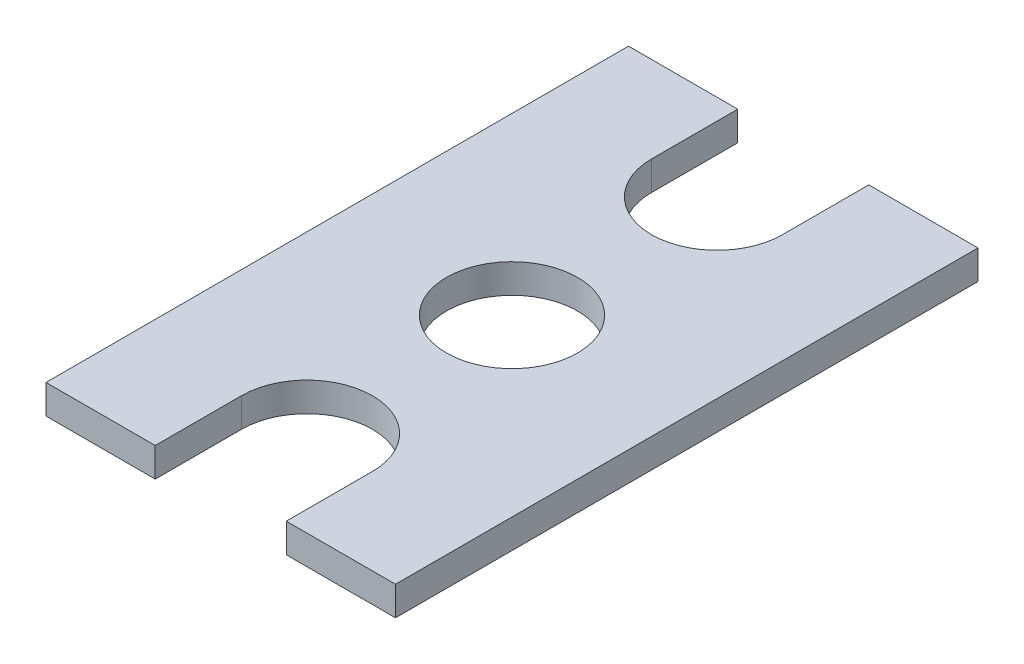
ISO-10303-21;
HEADER;
FILE_DESCRIPTION(('STEP AP214'),'2;1');
FILE_NAME('part.step','',(''),(''),'','','');
FILE_SCHEMA(('AUTOMOTIVE_DESIGN { 1 0 10303 214 1 1 1 1 }'));
ENDSEC;
DATA;
#1=APPLICATION_CONTEXT('core data for automotive mechanical design processes');
#2=APPLICATION_PROTOCOL_DEFINITION('international standard','automotive_design',2000,#1);
#3=PRODUCT_CONTEXT('',#1,'mechanical');
#4=PRODUCT('Part','Part','',(#3));
#5=PRODUCT_RELATED_PRODUCT_CATEGORY('part','',(#4));
#6=PRODUCT_DEFINITION_FORMATION('','',#4);
#7=PRODUCT_DEFINITION_CONTEXT('part definition',#1,'design');
#8=PRODUCT_DEFINITION('design','',#6,#7);
#9=PRODUCT_DEFINITION_SHAPE('','',#8);
#10=(LENGTH_UNIT() NAMED_UNIT(*) SI_UNIT(.MILLI.,.METRE.));
#11=(NAMED_UNIT(*) PLANE_ANGLE_UNIT() SI_UNIT($,.RADIAN.));
#12=(NAMED_UNIT(*) SI_UNIT($,.STERADIAN.) SOLID_ANGLE_UNIT());
#13=UNCERTAINTY_MEASURE_WITH_UNIT(LENGTH_MEASURE(1.E-05),#10,'distance_accuracy_value','');
#14=(GEOMETRIC_REPRESENTATION_CONTEXT(3) GLOBAL_UNCERTAINTY_ASSIGNED_CONTEXT((#13)) GLOBAL_UNIT_ASSIGNED_CONTEXT((#10,
#11,#12)) REPRESENTATION_CONTEXT('',''));
#15=CARTESIAN_POINT('',(0.,0.,0.));
#16=DIRECTION('',(0.,0.,1.));
#17=DIRECTION('',(1.,0.,0.));
#18=AXIS2_PLACEMENT_3D('',#15,#16,#17);
#19=CARTESIAN_POINT('',(-6.35,1.5875,10.287));
#20=DIRECTION('',(0.,1.,0.));
#21=DIRECTION('',(0.,0.,1.));
#22=AXIS2_PLACEMENT_3D('',#19,#20,#21);
#23=PLANE('',#22);
#24=CARTESIAN_POINT('',(3.175,1.5875,-5.588));
#25=DIRECTION('',(0.,1.,0.));
#26=DIRECTION('',(0.,0.,1.));
#27=AXIS2_PLACEMENT_3D('',#24,#25,#26);
#28=CIRCLE('',#27,3.571875);
#29=CARTESIAN_POINT('',(3.175,1.5875,-2.016125));
#30=VERTEX_POINT('',#29);
#31=EDGE_CURVE('E155',#30,#30,#28,.T.);
#32=ORIENTED_EDGE('',*,*,#31,.F.);
#33=EDGE_LOOP('',(#32));
#34=FACE_BOUND('',#33,.T.);
#35=DIRECTION('',(-1.,0.,0.));
#36=VECTOR('',#35,1.);
#37=CARTESIAN_POINT('',(-6.35,1.5875,-21.463));
#38=LINE('',#37,#36);
#39=CARTESIAN_POINT('',(12.7,1.5875,-21.463));
#40=VERTEX_POINT('',#39);
#41=CARTESIAN_POINT('',(6.74687500000019,1.5875,-21.463));
#42=VERTEX_POINT('',#41);
#43=EDGE_CURVE('E133',#40,#42,#38,.T.);
#44=ORIENTED_EDGE('',*,*,#43,.T.);
#45=DIRECTION('',(0.,0.,-1.));
#46=VECTOR('',#45,1.);
#47=CARTESIAN_POINT('',(6.74687500000016,1.5875,-16.764));
#48=LINE('',#47,#46);
#49=CARTESIAN_POINT('',(6.74687500000016,1.5875,-16.764));
#50=VERTEX_POINT('',#49);
#51=EDGE_CURVE('E117',#50,#42,#48,.T.);
#52=ORIENTED_EDGE('',*,*,#51,.F.);
#53=CARTESIAN_POINT('',(3.175,1.5875,-16.764));
#54=DIRECTION('',(0.,1.,0.));
#55=DIRECTION('',(0.,0.,1.));
#56=AXIS2_PLACEMENT_3D('',#53,#54,#55);
#57=CIRCLE('',#56,3.571875);
#58=CARTESIAN_POINT('',(-0.396874999999997,1.5875,-16.764));
#59=VERTEX_POINT('',#58);
#60=EDGE_CURVE('E212',#59,#50,#57,.T.);
#61=ORIENTED_EDGE('',*,*,#60,.F.);
#62=DIRECTION('',(0.,0.,1.));
#63=VECTOR('',#62,1.);
#64=CARTESIAN_POINT('',(-0.396874999999838,1.5875,-16.764));
#65=LINE('',#64,#63);
#66=CARTESIAN_POINT('',(-0.396874999999805,1.5875,-21.463));
#67=VERTEX_POINT('',#66);
#68=EDGE_CURVE('E53',#67,#59,#65,.T.);
#69=ORIENTED_EDGE('',*,*,#68,.F.);
#70=CARTESIAN_POINT('',(-6.35,1.5875,-21.463));
#71=VERTEX_POINT('',#70);
#72=EDGE_CURVE('E143',#67,#71,#38,.T.);
#73=ORIENTED_EDGE('',*,*,#72,.T.);
#74=DIRECTION('',(0.,0.,1.));
#75=VECTOR('',#74,1.);
#76=CARTESIAN_POINT('',(-6.35,1.5875,-21.463));
#77=LINE('',#76,#75);
#78=CARTESIAN_POINT('',(-6.35,1.5875,10.287));
#79=VERTEX_POINT('',#78);
#80=EDGE_CURVE('E162',#71,#79,#77,.T.);
#81=ORIENTED_EDGE('',*,*,#80,.T.);
#82=DIRECTION('',(1.,0.,0.));
#83=VECTOR('',#82,1.);
#84=CARTESIAN_POINT('',(-6.35,1.5875,10.287));
#85=LINE('',#84,#83);
#86=CARTESIAN_POINT('',(-0.396875000000075,1.5875,10.287));
#87=VERTEX_POINT('',#86);
#88=EDGE_CURVE('E222',#79,#87,#85,.T.);
#89=ORIENTED_EDGE('',*,*,#88,.T.);
#90=DIRECTION('',(0.,0.,1.));
#91=VECTOR('',#90,1.);
#92=CARTESIAN_POINT('',(-0.396875000000075,1.5875,5.588));
#93=LINE('',#92,#91);
#94=CARTESIAN_POINT('',(-0.396875000000075,1.5875,5.588));
#95=VERTEX_POINT('',#94);
#96=EDGE_CURVE('E188',#95,#87,#93,.T.);
#97=ORIENTED_EDGE('',*,*,#96,.F.);
#98=CARTESIAN_POINT('',(3.17499999999993,1.5875,5.588));
#99=DIRECTION('',(0.,1.,0.));
#100=DIRECTION('',(0.,0.,-1.));
#101=AXIS2_PLACEMENT_3D('',#98,#99,#100);
#102=CIRCLE('',#101,3.571875);
#103=CARTESIAN_POINT('',(6.74687499999993,1.5875,5.588));
#104=VERTEX_POINT('',#103);
#105=EDGE_CURVE('E207',#104,#95,#102,.T.);
#106=ORIENTED_EDGE('',*,*,#105,.F.);
#107=DIRECTION('',(0.,0.,-1.));
#108=VECTOR('',#107,1.);
#109=CARTESIAN_POINT('',(6.74687499999992,1.5875,5.588));
#110=LINE('',#109,#108);
#111=CARTESIAN_POINT('',(6.74687499999992,1.5875,10.287));
#112=VERTEX_POINT('',#111);
#113=EDGE_CURVE('E190',#112,#104,#110,.T.);
#114=ORIENTED_EDGE('',*,*,#113,.F.);
#115=CARTESIAN_POINT('',(12.7,1.5875,10.287));
#116=VERTEX_POINT('',#115);
#117=EDGE_CURVE('E221',#112,#116,#85,.T.);
#118=ORIENTED_EDGE('',*,*,#117,.T.);
#119=DIRECTION('',(0.,0.,-1.));
#120=VECTOR('',#119,1.);
#121=CARTESIAN_POINT('',(12.7,1.5875,-21.463));
#122=LINE('',#121,#120);
#123=EDGE_CURVE('E140',#116,#40,#122,.T.);
#124=ORIENTED_EDGE('',*,*,#123,.T.);
#125=EDGE_LOOP('',(#44,#52,#61,#69,#73,#81,#89,#97,#106,#114,#118,#124));
#126=FACE_BOUND('',#125,.T.);
#127=ADVANCED_FACE('F30',(#34,#126),#23,.T.);
#128=CARTESIAN_POINT('',(-6.35,0.,10.287));
#129=DIRECTION('',(0.,1.,0.));
#130=DIRECTION('',(0.,0.,1.));
#131=AXIS2_PLACEMENT_3D('',#128,#129,#130);
#132=PLANE('',#131);
#133=CARTESIAN_POINT('',(3.175,0.,-5.588));
#134=DIRECTION('',(0.,1.,0.));
#135=DIRECTION('',(0.,0.,1.));
#136=AXIS2_PLACEMENT_3D('',#133,#134,#135);
#137=CIRCLE('',#136,3.571875);
#138=CARTESIAN_POINT('',(3.175,0.,-2.016125));
#139=VERTEX_POINT('',#138);
#140=EDGE_CURVE('E214',#139,#139,#137,.T.);
#141=ORIENTED_EDGE('',*,*,#140,.T.);
#142=EDGE_LOOP('',(#141));
#143=FACE_BOUND('',#142,.T.);
#144=DIRECTION('',(0.,0.,-1.));
#145=VECTOR('',#144,1.);
#146=CARTESIAN_POINT('',(6.74687500000016,0.,-16.764));
#147=LINE('',#146,#145);
#148=CARTESIAN_POINT('',(6.746875,0.,-16.764));
#149=VERTEX_POINT('',#148);
#150=CARTESIAN_POINT('',(6.74687500000019,0.,-21.463));
#151=VERTEX_POINT('',#150);
#152=EDGE_CURVE('E45',#149,#151,#147,.T.);
#153=ORIENTED_EDGE('',*,*,#152,.T.);
#154=DIRECTION('',(-1.,0.,0.));
#155=VECTOR('',#154,1.);
#156=CARTESIAN_POINT('',(-6.35,0.,-21.463));
#157=LINE('',#156,#155);
#158=CARTESIAN_POINT('',(12.7,0.,-21.463));
#159=VERTEX_POINT('',#158);
#160=EDGE_CURVE('E135',#159,#151,#157,.T.);
#161=ORIENTED_EDGE('',*,*,#160,.F.);
#162=DIRECTION('',(0.,0.,-1.));
#163=VECTOR('',#162,1.);
#164=CARTESIAN_POINT('',(12.7,0.,-21.463));
#165=LINE('',#164,#163);
#166=CARTESIAN_POINT('',(12.7,0.,10.287));
#167=VERTEX_POINT('',#166);
#168=EDGE_CURVE('E159',#167,#159,#165,.T.);
#169=ORIENTED_EDGE('',*,*,#168,.F.);
#170=DIRECTION('',(1.,0.,0.));
#171=VECTOR('',#170,1.);
#172=CARTESIAN_POINT('',(-6.35,0.,10.287));
#173=LINE('',#172,#171);
#174=CARTESIAN_POINT('',(6.74687499999992,0.,10.287));
#175=VERTEX_POINT('',#174);
#176=EDGE_CURVE('E154',#175,#167,#173,.T.);
#177=ORIENTED_EDGE('',*,*,#176,.F.);
#178=DIRECTION('',(0.,0.,-1.));
#179=VECTOR('',#178,1.);
#180=CARTESIAN_POINT('',(6.74687499999992,0.,5.588));
#181=LINE('',#180,#179);
#182=CARTESIAN_POINT('',(6.74687499999992,0.,5.588));
#183=VERTEX_POINT('',#182);
#184=EDGE_CURVE('E191',#175,#183,#181,.T.);
#185=ORIENTED_EDGE('',*,*,#184,.T.);
#186=CARTESIAN_POINT('',(3.17499999999993,0.,5.588));
#187=DIRECTION('',(0.,1.,0.));
#188=DIRECTION('',(0.,0.,-1.));
#189=AXIS2_PLACEMENT_3D('',#186,#187,#188);
#190=CIRCLE('',#189,3.571875);
#191=CARTESIAN_POINT('',(-0.396875000000075,0.,5.588));
#192=VERTEX_POINT('',#191);
#193=EDGE_CURVE('E206',#183,#192,#190,.T.);
#194=ORIENTED_EDGE('',*,*,#193,.T.);
#195=DIRECTION('',(0.,0.,1.));
#196=VECTOR('',#195,1.);
#197=CARTESIAN_POINT('',(-0.396875000000075,0.,5.588));
#198=LINE('',#197,#196);
#199=CARTESIAN_POINT('',(-0.396875000000075,0.,10.287));
#200=VERTEX_POINT('',#199);
#201=EDGE_CURVE('E136',#192,#200,#198,.T.);
#202=ORIENTED_EDGE('',*,*,#201,.T.);
#203=CARTESIAN_POINT('',(-6.35,0.,10.287));
#204=VERTEX_POINT('',#203);
#205=EDGE_CURVE('E156',#204,#200,#173,.T.);
#206=ORIENTED_EDGE('',*,*,#205,.F.);
#207=DIRECTION('',(0.,0.,1.));
#208=VECTOR('',#207,1.);
#209=CARTESIAN_POINT('',(-6.35,0.,-21.463));
#210=LINE('',#209,#208);
#211=CARTESIAN_POINT('',(-6.35,0.,-21.463));
#212=VERTEX_POINT('',#211);
#213=EDGE_CURVE('E151',#212,#204,#210,.T.);
#214=ORIENTED_EDGE('',*,*,#213,.F.);
#215=CARTESIAN_POINT('',(-0.396874999999805,0.,-21.463));
#216=VERTEX_POINT('',#215);
#217=EDGE_CURVE('E161',#216,#212,#157,.T.);
#218=ORIENTED_EDGE('',*,*,#217,.F.);
#219=DIRECTION('',(0.,0.,1.));
#220=VECTOR('',#219,1.);
#221=CARTESIAN_POINT('',(-0.396874999999838,0.,-16.764));
#222=LINE('',#221,#220);
#223=CARTESIAN_POINT('',(-0.396874999999838,0.,-16.764));
#224=VERTEX_POINT('',#223);
#225=EDGE_CURVE('E126',#216,#224,#222,.T.);
#226=ORIENTED_EDGE('',*,*,#225,.T.);
#227=CARTESIAN_POINT('',(3.175,0.,-16.764));
#228=DIRECTION('',(0.,1.,0.));
#229=DIRECTION('',(0.,0.,1.));
#230=AXIS2_PLACEMENT_3D('',#227,#228,#229);
#231=CIRCLE('',#230,3.571875);
#232=EDGE_CURVE('E178',#224,#149,#231,.T.);
#233=ORIENTED_EDGE('',*,*,#232,.T.);
#234=EDGE_LOOP('',(#153,#161,#169,#177,#185,#194,#202,#206,#214,#218,#226,#233));
#235=FACE_BOUND('',#234,.T.);
#236=ADVANCED_FACE('F173',(#143,#235),#132,.F.);
#237=CARTESIAN_POINT('',(-6.35,1.5875,-21.463));
#238=DIRECTION('',(0.,0.,1.));
#239=DIRECTION('',(1.,0.,0.));
#240=AXIS2_PLACEMENT_3D('',#237,#238,#239);
#241=PLANE('',#240);
#242=DIRECTION('',(0.,-1.,0.));
#243=VECTOR('',#242,1.);
#244=CARTESIAN_POINT('',(6.74687500000019,1.5875,-21.463));
#245=LINE('',#244,#243);
#246=EDGE_CURVE('E120',#42,#151,#245,.T.);
#247=ORIENTED_EDGE('',*,*,#246,.F.);
#248=ORIENTED_EDGE('',*,*,#43,.F.);
#249=DIRECTION('',(0.,-1.,0.));
#250=VECTOR('',#249,1.);
#251=CARTESIAN_POINT('',(12.7,1.5875,-21.463));
#252=LINE('',#251,#250);
#253=EDGE_CURVE('E146',#40,#159,#252,.T.);
#254=ORIENTED_EDGE('',*,*,#253,.T.);
#255=ORIENTED_EDGE('',*,*,#160,.T.);
#256=EDGE_LOOP('',(#247,#248,#254,#255));
#257=FACE_BOUND('',#256,.T.);
#258=ADVANCED_FACE('F131',(#257),#241,.F.);
#259=DIRECTION('',(0.,-1.,0.));
#260=VECTOR('',#259,1.);
#261=CARTESIAN_POINT('',(-0.396874999999805,1.5875,-21.463));
#262=LINE('',#261,#260);
#263=EDGE_CURVE('E137',#67,#216,#262,.T.);
#264=ORIENTED_EDGE('',*,*,#263,.T.);
#265=ORIENTED_EDGE('',*,*,#217,.T.);
#266=DIRECTION('',(0.,-1.,0.));
#267=VECTOR('',#266,1.);
#268=CARTESIAN_POINT('',(-6.35,1.5875,-21.463));
#269=LINE('',#268,#267);
#270=EDGE_CURVE('E142',#71,#212,#269,.T.);
#271=ORIENTED_EDGE('',*,*,#270,.F.);
#272=ORIENTED_EDGE('',*,*,#72,.F.);
#273=EDGE_LOOP('',(#264,#265,#271,#272));
#274=FACE_BOUND('',#273,.T.);
#275=ADVANCED_FACE('F246',(#274),#241,.F.);
#276=CARTESIAN_POINT('',(3.175,1.5875,-16.764));
#277=DIRECTION('',(0.,-1.,0.));
#278=DIRECTION('',(0.,0.,-1.));
#279=AXIS2_PLACEMENT_3D('',#276,#277,#278);
#280=CYLINDRICAL_SURFACE('',#279,3.571875);
#281=ORIENTED_EDGE('',*,*,#60,.T.);
#282=DIRECTION('',(0.,-1.,0.));
#283=VECTOR('',#282,1.);
#284=CARTESIAN_POINT('',(6.74687500000016,1.5875,-16.764));
#285=LINE('',#284,#283);
#286=EDGE_CURVE('E121',#50,#149,#285,.T.);
#287=ORIENTED_EDGE('',*,*,#286,.T.);
#288=ORIENTED_EDGE('',*,*,#232,.F.);
#289=DIRECTION('',(0.,-1.,0.));
#290=VECTOR('',#289,1.);
#291=CARTESIAN_POINT('',(-0.396874999999838,1.5875,-16.764));
#292=LINE('',#291,#290);
#293=EDGE_CURVE('E184',#59,#224,#292,.T.);
#294=ORIENTED_EDGE('',*,*,#293,.F.);
#295=EDGE_LOOP('',(#281,#287,#288,#294));
#296=FACE_BOUND('',#295,.T.);
#297=ADVANCED_FACE('F250',(#296),#280,.F.);
#298=CARTESIAN_POINT('',(-6.35,1.5875,10.287));
#299=DIRECTION('',(0.,0.,-1.));
#300=DIRECTION('',(-1.,0.,0.));
#301=AXIS2_PLACEMENT_3D('',#298,#299,#300);
#302=PLANE('',#301);
#303=DIRECTION('',(0.,-1.,0.));
#304=VECTOR('',#303,1.);
#305=CARTESIAN_POINT('',(-0.396875000000075,1.5875,10.287));
#306=LINE('',#305,#304);
#307=EDGE_CURVE('E204',#87,#200,#306,.T.);
#308=ORIENTED_EDGE('',*,*,#307,.F.);
#309=ORIENTED_EDGE('',*,*,#88,.F.);
#310=DIRECTION('',(0.,-1.,0.));
#311=VECTOR('',#310,1.);
#312=CARTESIAN_POINT('',(-6.35,1.5875,10.287));
#313=LINE('',#312,#311);
#314=EDGE_CURVE('E11',#79,#204,#313,.T.);
#315=ORIENTED_EDGE('',*,*,#314,.T.);
#316=ORIENTED_EDGE('',*,*,#205,.T.);
#317=EDGE_LOOP('',(#308,#309,#315,#316));
#318=FACE_BOUND('',#317,.T.);
#319=ADVANCED_FACE('F239',(#318),#302,.F.);
#320=DIRECTION('',(0.,-1.,0.));
#321=VECTOR('',#320,1.);
#322=CARTESIAN_POINT('',(6.74687499999992,1.5875,10.287));
#323=LINE('',#322,#321);
#324=EDGE_CURVE('E201',#112,#175,#323,.T.);
#325=ORIENTED_EDGE('',*,*,#324,.T.);
#326=ORIENTED_EDGE('',*,*,#176,.T.);
#327=DIRECTION('',(0.,-1.,0.));
#328=VECTOR('',#327,1.);
#329=CARTESIAN_POINT('',(12.7,1.5875,10.287));
#330=LINE('',#329,#328);
#331=EDGE_CURVE('E38',#116,#167,#330,.T.);
#332=ORIENTED_EDGE('',*,*,#331,.F.);
#333=ORIENTED_EDGE('',*,*,#117,.F.);
#334=EDGE_LOOP('',(#325,#326,#332,#333));
#335=FACE_BOUND('',#334,.T.);
#336=ADVANCED_FACE('F227',(#335),#302,.F.);
#337=CARTESIAN_POINT('',(3.17499999999993,1.5875,5.588));
#338=DIRECTION('',(0.,-1.,0.));
#339=DIRECTION('',(0.,0.,-1.));
#340=AXIS2_PLACEMENT_3D('',#337,#338,#339);
#341=CYLINDRICAL_SURFACE('',#340,3.571875);
#342=ORIENTED_EDGE('',*,*,#105,.T.);
#343=DIRECTION('',(0.,-1.,0.));
#344=VECTOR('',#343,1.);
#345=CARTESIAN_POINT('',(-0.396875000000075,1.5875,5.588));
#346=LINE('',#345,#344);
#347=EDGE_CURVE('E193',#95,#192,#346,.T.);
#348=ORIENTED_EDGE('',*,*,#347,.T.);
#349=ORIENTED_EDGE('',*,*,#193,.F.);
#350=DIRECTION('',(0.,-1.,0.));
#351=VECTOR('',#350,1.);
#352=CARTESIAN_POINT('',(6.74687499999992,1.5875,5.588));
#353=LINE('',#352,#351);
#354=EDGE_CURVE('E199',#104,#183,#353,.T.);
#355=ORIENTED_EDGE('',*,*,#354,.F.);
#356=EDGE_LOOP('',(#342,#348,#349,#355));
#357=FACE_BOUND('',#356,.T.);
#358=ADVANCED_FACE('F233',(#357),#341,.F.);
#359=CARTESIAN_POINT('',(-6.35,1.5875,-21.463));
#360=DIRECTION('',(1.,0.,0.));
#361=DIRECTION('',(0.,0.,-1.));
#362=AXIS2_PLACEMENT_3D('',#359,#360,#361);
#363=PLANE('',#362);
#364=ORIENTED_EDGE('',*,*,#213,.T.);
#365=ORIENTED_EDGE('',*,*,#314,.F.);
#366=ORIENTED_EDGE('',*,*,#80,.F.);
#367=ORIENTED_EDGE('',*,*,#270,.T.);
#368=EDGE_LOOP('',(#364,#365,#366,#367));
#369=FACE_BOUND('',#368,.T.);
#370=ADVANCED_FACE('F32',(#369),#363,.F.);
#371=CARTESIAN_POINT('',(12.7,1.5875,-21.463));
#372=DIRECTION('',(-1.,0.,0.));
#373=DIRECTION('',(0.,0.,1.));
#374=AXIS2_PLACEMENT_3D('',#371,#372,#373);
#375=PLANE('',#374);
#376=ORIENTED_EDGE('',*,*,#168,.T.);
#377=ORIENTED_EDGE('',*,*,#253,.F.);
#378=ORIENTED_EDGE('',*,*,#123,.F.);
#379=ORIENTED_EDGE('',*,*,#331,.T.);
#380=EDGE_LOOP('',(#376,#377,#378,#379));
#381=FACE_BOUND('',#380,.T.);
#382=ADVANCED_FACE('F168',(#381),#375,.F.);
#383=CARTESIAN_POINT('',(3.175,1.5875,-5.588));
#384=DIRECTION('',(0.,-1.,0.));
#385=DIRECTION('',(0.,0.,-1.));
#386=AXIS2_PLACEMENT_3D('',#383,#384,#385);
#387=CYLINDRICAL_SURFACE('',#386,3.571875);
#388=ORIENTED_EDGE('',*,*,#31,.T.);
#389=EDGE_LOOP('',(#388));
#390=FACE_BOUND('',#389,.T.);
#391=ORIENTED_EDGE('',*,*,#140,.F.);
#392=EDGE_LOOP('',(#391));
#393=FACE_BOUND('',#392,.T.);
#394=ADVANCED_FACE('F269',(#390,#393),#387,.F.);
#395=CARTESIAN_POINT('',(6.74687499999992,1.5875,5.588));
#396=DIRECTION('',(-1.,0.,0.));
#397=DIRECTION('',(0.,0.,1.));
#398=AXIS2_PLACEMENT_3D('',#395,#396,#397);
#399=PLANE('',#398);
#400=ORIENTED_EDGE('',*,*,#184,.F.);
#401=ORIENTED_EDGE('',*,*,#324,.F.);
#402=ORIENTED_EDGE('',*,*,#113,.T.);
#403=ORIENTED_EDGE('',*,*,#354,.T.);
#404=EDGE_LOOP('',(#400,#401,#402,#403));
#405=FACE_BOUND('',#404,.T.);
#406=ADVANCED_FACE('F229',(#405),#399,.T.);
#407=CARTESIAN_POINT('',(-0.396875000000075,1.5875,5.588));
#408=DIRECTION('',(1.,0.,0.));
#409=DIRECTION('',(0.,0.,-1.));
#410=AXIS2_PLACEMENT_3D('',#407,#408,#409);
#411=PLANE('',#410);
#412=ORIENTED_EDGE('',*,*,#201,.F.);
#413=ORIENTED_EDGE('',*,*,#347,.F.);
#414=ORIENTED_EDGE('',*,*,#96,.T.);
#415=ORIENTED_EDGE('',*,*,#307,.T.);
#416=EDGE_LOOP('',(#412,#413,#414,#415));
#417=FACE_BOUND('',#416,.T.);
#418=ADVANCED_FACE('F235',(#417),#411,.T.);
#419=CARTESIAN_POINT('',(-0.396874999999838,1.5875,-16.764));
#420=DIRECTION('',(1.,0.,0.));
#421=DIRECTION('',(0.,0.,-1.));
#422=AXIS2_PLACEMENT_3D('',#419,#420,#421);
#423=PLANE('',#422);
#424=ORIENTED_EDGE('',*,*,#225,.F.);
#425=ORIENTED_EDGE('',*,*,#263,.F.);
#426=ORIENTED_EDGE('',*,*,#68,.T.);
#427=ORIENTED_EDGE('',*,*,#293,.T.);
#428=EDGE_LOOP('',(#424,#425,#426,#427));
#429=FACE_BOUND('',#428,.T.);
#430=ADVANCED_FACE('F248',(#429),#423,.T.);
#431=CARTESIAN_POINT('',(6.74687500000016,1.5875,-16.764));
#432=DIRECTION('',(-1.,0.,0.));
#433=DIRECTION('',(0.,0.,1.));
#434=AXIS2_PLACEMENT_3D('',#431,#432,#433);
#435=PLANE('',#434);
#436=ORIENTED_EDGE('',*,*,#152,.F.);
#437=ORIENTED_EDGE('',*,*,#286,.F.);
#438=ORIENTED_EDGE('',*,*,#51,.T.);
#439=ORIENTED_EDGE('',*,*,#246,.T.);
#440=EDGE_LOOP('',(#436,#437,#438,#439));
#441=FACE_BOUND('',#440,.T.);
#442=ADVANCED_FACE('F119',(#441),#435,.T.);
#443=CLOSED_SHELL('',(#127,#236,#258,#275,#297,#319,#336,#358,#370,#382,#394,#406,#418,#430,#442));
#444=MANIFOLD_SOLID_BREP('B2',#443);
#445=ADVANCED_BREP_SHAPE_REPRESENTATION('',(#18,#444),#14);
#446=SHAPE_DEFINITION_REPRESENTATION(#9,#445);
ENDSEC;
END-ISO-10303-21;
